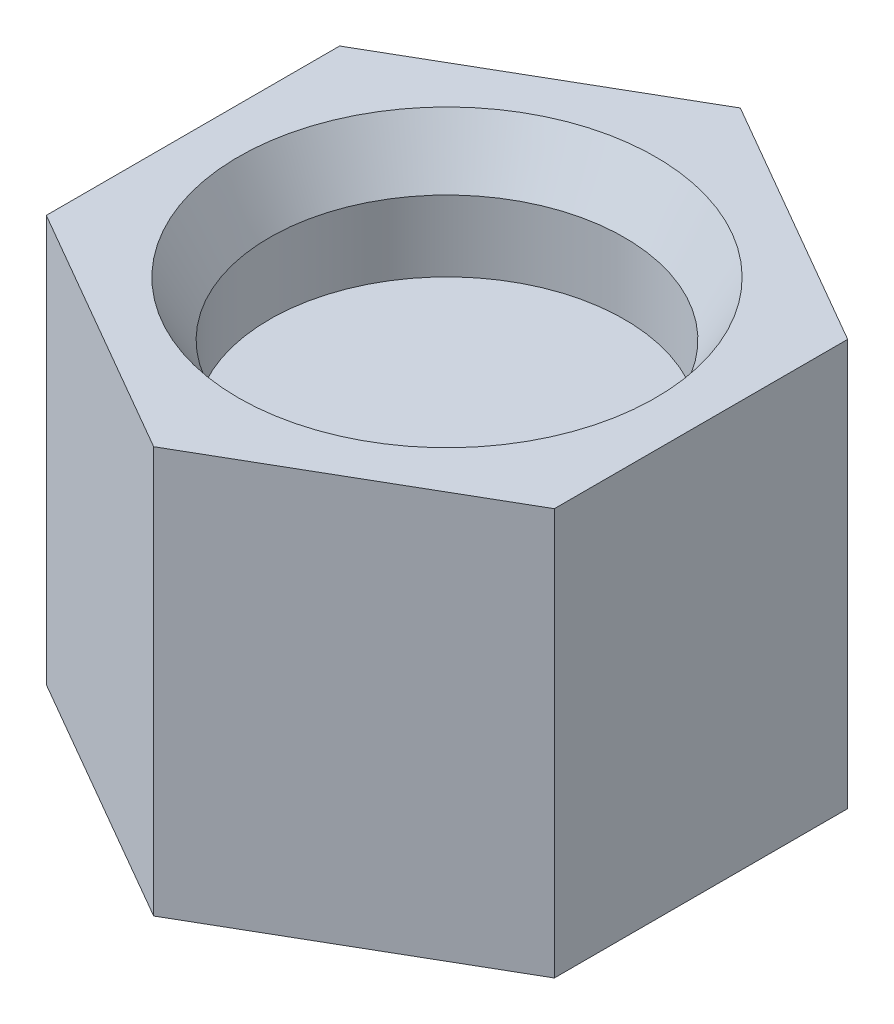
ISO-10303-21;
HEADER;
FILE_DESCRIPTION(('STEP AP214'),'2;1');
FILE_NAME('part.step','',(''),(''),'','','');
FILE_SCHEMA(('AUTOMOTIVE_DESIGN { 1 0 10303 214 1 1 1 1 }'));
ENDSEC;
DATA;
#1=APPLICATION_CONTEXT('core data for automotive mechanical design processes');
#2=APPLICATION_PROTOCOL_DEFINITION('international standard','automotive_design',2000,#1);
#3=PRODUCT_CONTEXT('',#1,'mechanical');
#4=PRODUCT('Part','Part','',(#3));
#5=PRODUCT_RELATED_PRODUCT_CATEGORY('part','',(#4));
#6=PRODUCT_DEFINITION_FORMATION('','',#4);
#7=PRODUCT_DEFINITION_CONTEXT('part definition',#1,'design');
#8=PRODUCT_DEFINITION('design','',#6,#7);
#9=PRODUCT_DEFINITION_SHAPE('','',#8);
#10=(LENGTH_UNIT() NAMED_UNIT(*) SI_UNIT(.MILLI.,.METRE.));
#11=(NAMED_UNIT(*) PLANE_ANGLE_UNIT() SI_UNIT($,.RADIAN.));
#12=(NAMED_UNIT(*) SI_UNIT($,.STERADIAN.) SOLID_ANGLE_UNIT());
#13=UNCERTAINTY_MEASURE_WITH_UNIT(LENGTH_MEASURE(1.E-05),#10,'distance_accuracy_value','');
#14=(GEOMETRIC_REPRESENTATION_CONTEXT(3) GLOBAL_UNCERTAINTY_ASSIGNED_CONTEXT((#13)) GLOBAL_UNIT_ASSIGNED_CONTEXT((#10,
#11,#12)) REPRESENTATION_CONTEXT('',''));
#15=CARTESIAN_POINT('',(0.,0.,0.));
#16=DIRECTION('',(0.,0.,1.));
#17=DIRECTION('',(1.,0.,0.));
#18=AXIS2_PLACEMENT_3D('',#15,#16,#17);
#19=CARTESIAN_POINT('',(0.,6.,0.));
#20=DIRECTION('',(0.,1.,0.));
#21=DIRECTION('',(0.,0.,1.));
#22=AXIS2_PLACEMENT_3D('',#19,#20,#21);
#23=PLANE('',#22);
#24=CARTESIAN_POINT('',(0.,6.,0.));
#25=DIRECTION('',(0.,1.,0.));
#26=DIRECTION('',(0.,0.,1.));
#27=AXIS2_PLACEMENT_3D('',#24,#25,#26);
#28=CIRCLE('',#27,13.35);
#29=CARTESIAN_POINT('',(0.,6.,13.35));
#30=VERTEX_POINT('',#29);
#31=EDGE_CURVE('E11',#30,#30,#28,.F.);
#32=ORIENTED_EDGE('',*,*,#31,.T.);
#33=EDGE_LOOP('',(#32));
#34=FACE_BOUND('',#33,.T.);
#35=DIRECTION('',(0.,0.,-1.));
#36=VECTOR('',#35,1.);
#37=CARTESIAN_POINT('',(16.25,6.,9.38194187433142));
#38=LINE('',#37,#36);
#39=CARTESIAN_POINT('',(16.25,6.,9.38194187433142));
#40=VERTEX_POINT('',#39);
#41=CARTESIAN_POINT('',(16.25,6.,-9.38194187433142));
#42=VERTEX_POINT('',#41);
#43=EDGE_CURVE('E142',#40,#42,#38,.T.);
#44=ORIENTED_EDGE('',*,*,#43,.T.);
#45=DIRECTION('',(-0.866025403784439,0.,-0.5));
#46=VECTOR('',#45,1.);
#47=CARTESIAN_POINT('',(16.25,6.,-9.38194187433142));
#48=LINE('',#47,#46);
#49=CARTESIAN_POINT('',(0.,6.,-18.7638837486628));
#50=VERTEX_POINT('',#49);
#51=EDGE_CURVE('E144',#42,#50,#48,.T.);
#52=ORIENTED_EDGE('',*,*,#51,.T.);
#53=DIRECTION('',(-0.866025403784439,0.,0.5));
#54=VECTOR('',#53,1.);
#55=CARTESIAN_POINT('',(0.,6.,-18.7638837486628));
#56=LINE('',#55,#54);
#57=CARTESIAN_POINT('',(-16.25,6.,-9.38194187433142));
#58=VERTEX_POINT('',#57);
#59=EDGE_CURVE('E146',#50,#58,#56,.T.);
#60=ORIENTED_EDGE('',*,*,#59,.T.);
#61=DIRECTION('',(0.,0.,1.));
#62=VECTOR('',#61,1.);
#63=CARTESIAN_POINT('',(-16.25,6.,-9.38194187433142));
#64=LINE('',#63,#62);
#65=CARTESIAN_POINT('',(-16.25,6.,9.38194187433142));
#66=VERTEX_POINT('',#65);
#67=EDGE_CURVE('E148',#58,#66,#64,.T.);
#68=ORIENTED_EDGE('',*,*,#67,.T.);
#69=DIRECTION('',(0.866025403784439,0.,0.5));
#70=VECTOR('',#69,1.);
#71=CARTESIAN_POINT('',(-16.25,6.,9.38194187433142));
#72=LINE('',#71,#70);
#73=CARTESIAN_POINT('',(0.,6.,18.7638837486628));
#74=VERTEX_POINT('',#73);
#75=EDGE_CURVE('E150',#66,#74,#72,.T.);
#76=ORIENTED_EDGE('',*,*,#75,.T.);
#77=DIRECTION('',(0.866025403784439,0.,-0.5));
#78=VECTOR('',#77,1.);
#79=CARTESIAN_POINT('',(0.,6.,18.7638837486628));
#80=LINE('',#79,#78);
#81=EDGE_CURVE('E59',#74,#40,#80,.T.);
#82=ORIENTED_EDGE('',*,*,#81,.T.);
#83=EDGE_LOOP('',(#44,#52,#60,#68,#76,#82));
#84=FACE_BOUND('',#83,.T.);
#85=ADVANCED_FACE('F35',(#34,#84),#23,.T.);
#86=CARTESIAN_POINT('',(16.25,6.,9.38194187433142));
#87=DIRECTION('',(-1.,0.,0.));
#88=DIRECTION('',(0.,0.,1.));
#89=AXIS2_PLACEMENT_3D('',#86,#87,#88);
#90=PLANE('',#89);
#91=DIRECTION('',(0.,-1.,0.));
#92=VECTOR('',#91,1.);
#93=CARTESIAN_POINT('',(16.25,6.,9.38194187433142));
#94=LINE('',#93,#92);
#95=CARTESIAN_POINT('',(16.25,-20.,9.38194187433142));
#96=VERTEX_POINT('',#95);
#97=EDGE_CURVE('E153',#40,#96,#94,.T.);
#98=ORIENTED_EDGE('',*,*,#97,.T.);
#99=DIRECTION('',(0.,0.,1.));
#100=VECTOR('',#99,1.);
#101=CARTESIAN_POINT('',(16.25,-20.,-9.38194187433142));
#102=LINE('',#101,#100);
#103=CARTESIAN_POINT('',(16.25,-20.,-9.38194187433142));
#104=VERTEX_POINT('',#103);
#105=EDGE_CURVE('E123',#104,#96,#102,.T.);
#106=ORIENTED_EDGE('',*,*,#105,.F.);
#107=DIRECTION('',(0.,-1.,0.));
#108=VECTOR('',#107,1.);
#109=CARTESIAN_POINT('',(16.25,6.,-9.38194187433142));
#110=LINE('',#109,#108);
#111=EDGE_CURVE('E163',#42,#104,#110,.T.);
#112=ORIENTED_EDGE('',*,*,#111,.F.);
#113=ORIENTED_EDGE('',*,*,#43,.F.);
#114=EDGE_LOOP('',(#98,#106,#112,#113));
#115=FACE_BOUND('',#114,.T.);
#116=ADVANCED_FACE('F182',(#115),#90,.F.);
#117=CARTESIAN_POINT('',(16.25,6.,-9.38194187433142));
#118=DIRECTION('',(-0.5,0.,0.866025403784439));
#119=DIRECTION('',(0.866025403784439,0.,0.5));
#120=AXIS2_PLACEMENT_3D('',#117,#118,#119);
#121=PLANE('',#120);
#122=ORIENTED_EDGE('',*,*,#111,.T.);
#123=DIRECTION('',(0.866025403784439,0.,0.5));
#124=VECTOR('',#123,1.);
#125=CARTESIAN_POINT('',(0.,-20.,-18.7638837486628));
#126=LINE('',#125,#124);
#127=CARTESIAN_POINT('',(0.,-20.,-18.7638837486628));
#128=VERTEX_POINT('',#127);
#129=EDGE_CURVE('E139',#128,#104,#126,.T.);
#130=ORIENTED_EDGE('',*,*,#129,.F.);
#131=DIRECTION('',(0.,-1.,0.));
#132=VECTOR('',#131,1.);
#133=CARTESIAN_POINT('',(0.,6.,-18.7638837486628));
#134=LINE('',#133,#132);
#135=EDGE_CURVE('E161',#50,#128,#134,.T.);
#136=ORIENTED_EDGE('',*,*,#135,.F.);
#137=ORIENTED_EDGE('',*,*,#51,.F.);
#138=EDGE_LOOP('',(#122,#130,#136,#137));
#139=FACE_BOUND('',#138,.T.);
#140=ADVANCED_FACE('F188',(#139),#121,.F.);
#141=CARTESIAN_POINT('',(0.,6.,-18.7638837486628));
#142=DIRECTION('',(0.5,0.,0.866025403784439));
#143=DIRECTION('',(0.866025403784439,0.,-0.5));
#144=AXIS2_PLACEMENT_3D('',#141,#142,#143);
#145=PLANE('',#144);
#146=ORIENTED_EDGE('',*,*,#135,.T.);
#147=DIRECTION('',(0.866025403784439,0.,-0.5));
#148=VECTOR('',#147,1.);
#149=CARTESIAN_POINT('',(-16.25,-20.,-9.38194187433142));
#150=LINE('',#149,#148);
#151=CARTESIAN_POINT('',(-16.25,-20.,-9.38194187433142));
#152=VERTEX_POINT('',#151);
#153=EDGE_CURVE('E136',#152,#128,#150,.T.);
#154=ORIENTED_EDGE('',*,*,#153,.F.);
#155=DIRECTION('',(0.,-1.,0.));
#156=VECTOR('',#155,1.);
#157=CARTESIAN_POINT('',(-16.25,6.,-9.38194187433142));
#158=LINE('',#157,#156);
#159=EDGE_CURVE('E159',#58,#152,#158,.T.);
#160=ORIENTED_EDGE('',*,*,#159,.F.);
#161=ORIENTED_EDGE('',*,*,#59,.F.);
#162=EDGE_LOOP('',(#146,#154,#160,#161));
#163=FACE_BOUND('',#162,.T.);
#164=ADVANCED_FACE('F204',(#163),#145,.F.);
#165=CARTESIAN_POINT('',(-16.25,6.,-9.38194187433142));
#166=DIRECTION('',(1.,0.,0.));
#167=DIRECTION('',(0.,0.,-1.));
#168=AXIS2_PLACEMENT_3D('',#165,#166,#167);
#169=PLANE('',#168);
#170=ORIENTED_EDGE('',*,*,#159,.T.);
#171=DIRECTION('',(0.,0.,-1.));
#172=VECTOR('',#171,1.);
#173=CARTESIAN_POINT('',(-16.25,-20.,9.38194187433142));
#174=LINE('',#173,#172);
#175=CARTESIAN_POINT('',(-16.25,-20.,9.38194187433142));
#176=VERTEX_POINT('',#175);
#177=EDGE_CURVE('E133',#176,#152,#174,.T.);
#178=ORIENTED_EDGE('',*,*,#177,.F.);
#179=DIRECTION('',(0.,-1.,0.));
#180=VECTOR('',#179,1.);
#181=CARTESIAN_POINT('',(-16.25,6.,9.38194187433142));
#182=LINE('',#181,#180);
#183=EDGE_CURVE('E157',#66,#176,#182,.T.);
#184=ORIENTED_EDGE('',*,*,#183,.F.);
#185=ORIENTED_EDGE('',*,*,#67,.F.);
#186=EDGE_LOOP('',(#170,#178,#184,#185));
#187=FACE_BOUND('',#186,.T.);
#188=ADVANCED_FACE('F200',(#187),#169,.F.);
#189=CARTESIAN_POINT('',(-16.25,6.,9.38194187433142));
#190=DIRECTION('',(0.5,0.,-0.866025403784438));
#191=DIRECTION('',(-0.866025403784439,0.,-0.5));
#192=AXIS2_PLACEMENT_3D('',#189,#190,#191);
#193=PLANE('',#192);
#194=ORIENTED_EDGE('',*,*,#183,.T.);
#195=DIRECTION('',(-0.866025403784439,0.,-0.5));
#196=VECTOR('',#195,1.);
#197=CARTESIAN_POINT('',(0.,-20.,18.7638837486628));
#198=LINE('',#197,#196);
#199=CARTESIAN_POINT('',(0.,-20.,18.7638837486628));
#200=VERTEX_POINT('',#199);
#201=EDGE_CURVE('E130',#200,#176,#198,.T.);
#202=ORIENTED_EDGE('',*,*,#201,.F.);
#203=DIRECTION('',(0.,-1.,0.));
#204=VECTOR('',#203,1.);
#205=CARTESIAN_POINT('',(0.,6.,18.7638837486628));
#206=LINE('',#205,#204);
#207=EDGE_CURVE('E155',#74,#200,#206,.T.);
#208=ORIENTED_EDGE('',*,*,#207,.F.);
#209=ORIENTED_EDGE('',*,*,#75,.F.);
#210=EDGE_LOOP('',(#194,#202,#208,#209));
#211=FACE_BOUND('',#210,.T.);
#212=ADVANCED_FACE('F196',(#211),#193,.F.);
#213=CARTESIAN_POINT('',(0.,6.,18.7638837486628));
#214=DIRECTION('',(-0.5,0.,-0.866025403784439));
#215=DIRECTION('',(-0.866025403784439,0.,0.5));
#216=AXIS2_PLACEMENT_3D('',#213,#214,#215);
#217=PLANE('',#216);
#218=ORIENTED_EDGE('',*,*,#207,.T.);
#219=DIRECTION('',(-0.866025403784439,0.,0.5));
#220=VECTOR('',#219,1.);
#221=CARTESIAN_POINT('',(16.25,-20.,9.38194187433142));
#222=LINE('',#221,#220);
#223=EDGE_CURVE('E127',#96,#200,#222,.T.);
#224=ORIENTED_EDGE('',*,*,#223,.F.);
#225=ORIENTED_EDGE('',*,*,#97,.F.);
#226=ORIENTED_EDGE('',*,*,#81,.F.);
#227=EDGE_LOOP('',(#218,#224,#225,#226));
#228=FACE_BOUND('',#227,.T.);
#229=ADVANCED_FACE('F193',(#228),#217,.F.);
#230=CARTESIAN_POINT('',(0.,6.,0.));
#231=DIRECTION('',(0.,-1.,0.));
#232=DIRECTION('',(0.,0.,-1.));
#233=AXIS2_PLACEMENT_3D('',#230,#231,#232);
#234=CYLINDRICAL_SURFACE('',#233,11.35);
#235=CARTESIAN_POINT('',(0.,2.53589838486225,0.));
#236=DIRECTION('',(0.,1.,0.));
#237=DIRECTION('',(0.,0.,1.));
#238=AXIS2_PLACEMENT_3D('',#235,#236,#237);
#239=CIRCLE('',#238,11.35);
#240=CARTESIAN_POINT('',(0.,2.53589838486225,11.35));
#241=VERTEX_POINT('',#240);
#242=EDGE_CURVE('E44',#241,#241,#239,.T.);
#243=ORIENTED_EDGE('',*,*,#242,.T.);
#244=EDGE_LOOP('',(#243));
#245=FACE_BOUND('',#244,.T.);
#246=CARTESIAN_POINT('',(0.,-2.,0.));
#247=DIRECTION('',(0.,1.,0.));
#248=DIRECTION('',(0.,0.,1.));
#249=AXIS2_PLACEMENT_3D('',#246,#247,#248);
#250=CIRCLE('',#249,11.35);
#251=CARTESIAN_POINT('',(0.,-2.,11.35));
#252=VERTEX_POINT('',#251);
#253=EDGE_CURVE('E121',#252,#252,#250,.T.);
#254=ORIENTED_EDGE('',*,*,#253,.F.);
#255=EDGE_LOOP('',(#254));
#256=FACE_BOUND('',#255,.T.);
#257=ADVANCED_FACE('F167',(#245,#256),#234,.F.);
#258=CARTESIAN_POINT('',(0.,-20.,0.));
#259=DIRECTION('',(0.,-1.,0.));
#260=DIRECTION('',(0.,0.,-1.));
#261=AXIS2_PLACEMENT_3D('',#258,#259,#260);
#262=PLANE('',#261);
#263=DIRECTION('',(0.,0.,-1.));
#264=VECTOR('',#263,1.);
#265=CARTESIAN_POINT('',(-2.61809090751257,-20.,0.));
#266=LINE('',#265,#264);
#267=CARTESIAN_POINT('',(-2.61809090751257,-20.,1.66));
#268=VERTEX_POINT('',#267);
#269=CARTESIAN_POINT('',(-2.61809090751257,-20.,-1.66));
#270=VERTEX_POINT('',#269);
#271=EDGE_CURVE('E51',#268,#270,#266,.T.);
#272=ORIENTED_EDGE('',*,*,#271,.F.);
#273=CARTESIAN_POINT('',(0.,-20.,0.));
#274=DIRECTION('',(0.,-1.,0.));
#275=DIRECTION('',(0.,0.,-1.));
#276=AXIS2_PLACEMENT_3D('',#273,#274,#275);
#277=CIRCLE('',#276,3.1);
#278=EDGE_CURVE('E114',#270,#268,#277,.T.);
#279=ORIENTED_EDGE('',*,*,#278,.F.);
#280=EDGE_LOOP('',(#272,#279));
#281=FACE_BOUND('',#280,.T.);
#282=ORIENTED_EDGE('',*,*,#105,.T.);
#283=ORIENTED_EDGE('',*,*,#223,.T.);
#284=ORIENTED_EDGE('',*,*,#201,.T.);
#285=ORIENTED_EDGE('',*,*,#177,.T.);
#286=ORIENTED_EDGE('',*,*,#153,.T.);
#287=ORIENTED_EDGE('',*,*,#129,.T.);
#288=EDGE_LOOP('',(#282,#283,#284,#285,#286,#287));
#289=FACE_BOUND('',#288,.T.);
#290=ADVANCED_FACE('F219',(#281,#289),#262,.T.);
#291=CARTESIAN_POINT('',(-2.61809090751257,-5.,0.));
#292=DIRECTION('',(-1.,0.,0.));
#293=DIRECTION('',(0.,0.,1.));
#294=AXIS2_PLACEMENT_3D('',#291,#292,#293);
#295=PLANE('',#294);
#296=ORIENTED_EDGE('',*,*,#271,.T.);
#297=DIRECTION('',(0.,-1.,0.));
#298=VECTOR('',#297,1.);
#299=CARTESIAN_POINT('',(-2.61809090751257,-5.,-1.66));
#300=LINE('',#299,#298);
#301=CARTESIAN_POINT('',(-2.61809090751257,-5.,-1.66));
#302=VERTEX_POINT('',#301);
#303=EDGE_CURVE('E100',#302,#270,#300,.T.);
#304=ORIENTED_EDGE('',*,*,#303,.F.);
#305=DIRECTION('',(0.,0.,-1.));
#306=VECTOR('',#305,1.);
#307=CARTESIAN_POINT('',(-2.61809090751257,-5.,0.));
#308=LINE('',#307,#306);
#309=CARTESIAN_POINT('',(-2.61809090751257,-5.,1.66));
#310=VERTEX_POINT('',#309);
#311=EDGE_CURVE('E103',#310,#302,#308,.T.);
#312=ORIENTED_EDGE('',*,*,#311,.F.);
#313=DIRECTION('',(0.,-1.,0.));
#314=VECTOR('',#313,1.);
#315=CARTESIAN_POINT('',(-2.61809090751257,-5.,1.66));
#316=LINE('',#315,#314);
#317=EDGE_CURVE('E109',#310,#268,#316,.T.);
#318=ORIENTED_EDGE('',*,*,#317,.T.);
#319=EDGE_LOOP('',(#296,#304,#312,#318));
#320=FACE_BOUND('',#319,.T.);
#321=ADVANCED_FACE('F102',(#320),#295,.F.);
#322=CARTESIAN_POINT('',(0.,-5.,0.));
#323=DIRECTION('',(0.,-1.,0.));
#324=DIRECTION('',(0.,0.,-1.));
#325=AXIS2_PLACEMENT_3D('',#322,#323,#324);
#326=CYLINDRICAL_SURFACE('',#325,3.1);
#327=ORIENTED_EDGE('',*,*,#278,.T.);
#328=ORIENTED_EDGE('',*,*,#317,.F.);
#329=CARTESIAN_POINT('',(0.,-5.,0.));
#330=DIRECTION('',(0.,-1.,0.));
#331=DIRECTION('',(0.,0.,-1.));
#332=AXIS2_PLACEMENT_3D('',#329,#330,#331);
#333=CIRCLE('',#332,3.1);
#334=EDGE_CURVE('E110',#302,#310,#333,.T.);
#335=ORIENTED_EDGE('',*,*,#334,.F.);
#336=ORIENTED_EDGE('',*,*,#303,.T.);
#337=EDGE_LOOP('',(#327,#328,#335,#336));
#338=FACE_BOUND('',#337,.T.);
#339=ADVANCED_FACE('F116',(#338),#326,.F.);
#340=CARTESIAN_POINT('',(0.,-5.,0.));
#341=DIRECTION('',(0.,-1.,0.));
#342=DIRECTION('',(0.,0.,-1.));
#343=AXIS2_PLACEMENT_3D('',#340,#341,#342);
#344=PLANE('',#343);
#345=ORIENTED_EDGE('',*,*,#311,.T.);
#346=ORIENTED_EDGE('',*,*,#334,.T.);
#347=EDGE_LOOP('',(#345,#346));
#348=FACE_BOUND('',#347,.T.);
#349=ADVANCED_FACE('F113',(#348),#344,.T.);
#350=CARTESIAN_POINT('',(0.,2.53589838486225,0.));
#351=DIRECTION('',(0.,1.,0.));
#352=DIRECTION('',(0.,0.,1.));
#353=AXIS2_PLACEMENT_3D('',#350,#351,#352);
#354=CONICAL_SURFACE('',#353,11.35,0.5235987755983);
#355=ORIENTED_EDGE('',*,*,#31,.F.);
#356=EDGE_LOOP('',(#355));
#357=FACE_BOUND('',#356,.T.);
#358=ORIENTED_EDGE('',*,*,#242,.F.);
#359=EDGE_LOOP('',(#358));
#360=FACE_BOUND('',#359,.T.);
#361=ADVANCED_FACE('F38',(#357,#360),#354,.F.);
#362=CARTESIAN_POINT('',(0.,-2.,0.));
#363=DIRECTION('',(0.,1.,0.));
#364=DIRECTION('',(0.,0.,1.));
#365=AXIS2_PLACEMENT_3D('',#362,#363,#364);
#366=PLANE('',#365);
#367=ORIENTED_EDGE('',*,*,#253,.T.);
#368=EDGE_LOOP('',(#367));
#369=FACE_BOUND('',#368,.T.);
#370=ADVANCED_FACE('F171',(#369),#366,.T.);
#371=CLOSED_SHELL('',(#85,#116,#140,#164,#188,#212,#229,#257,#290,#321,#339,#349,#361,#370));
#372=MANIFOLD_SOLID_BREP('B2',#371);
#373=ADVANCED_BREP_SHAPE_REPRESENTATION('',(#18,#372),#14);
#374=SHAPE_DEFINITION_REPRESENTATION(#9,#373);
ENDSEC;
END-ISO-10303-21;
